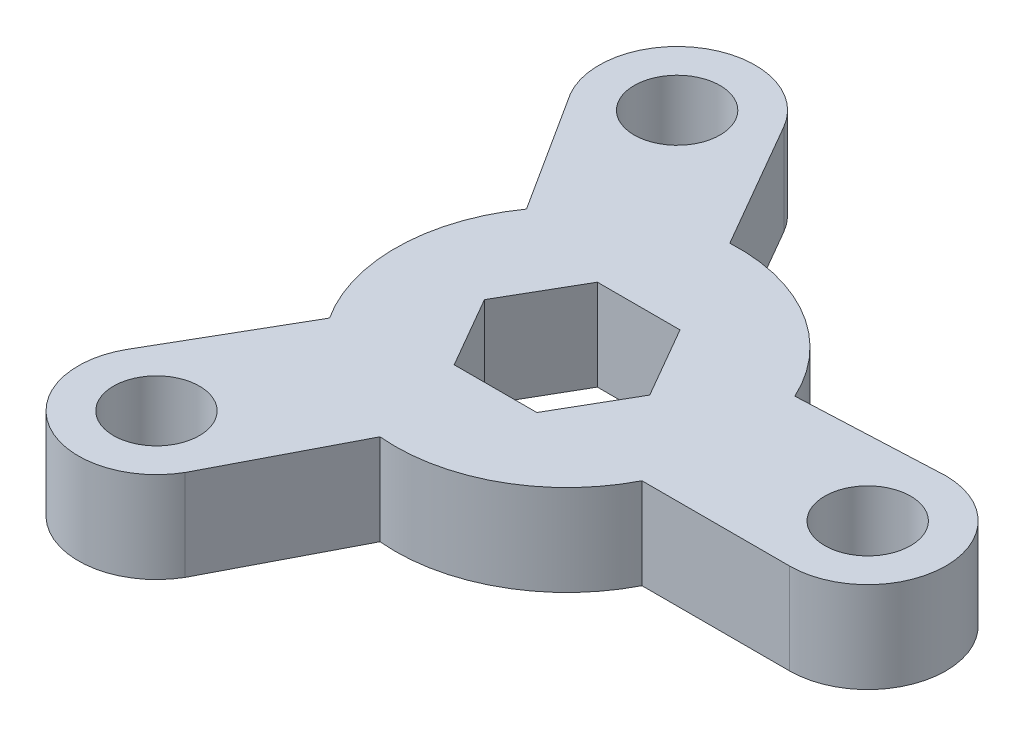
ISO-10303-21;
HEADER;
FILE_DESCRIPTION(('STEP AP214'),'2;1');
FILE_NAME('part.step','',(''),(''),'','','');
FILE_SCHEMA(('AUTOMOTIVE_DESIGN { 1 0 10303 214 1 1 1 1 }'));
ENDSEC;
DATA;
#1=APPLICATION_CONTEXT('core data for automotive mechanical design processes');
#2=APPLICATION_PROTOCOL_DEFINITION('international standard','automotive_design',2000,#1);
#3=PRODUCT_CONTEXT('',#1,'mechanical');
#4=PRODUCT('Part','Part','',(#3));
#5=PRODUCT_RELATED_PRODUCT_CATEGORY('part','',(#4));
#6=PRODUCT_DEFINITION_FORMATION('','',#4);
#7=PRODUCT_DEFINITION_CONTEXT('part definition',#1,'design');
#8=PRODUCT_DEFINITION('design','',#6,#7);
#9=PRODUCT_DEFINITION_SHAPE('','',#8);
#10=(LENGTH_UNIT() NAMED_UNIT(*) SI_UNIT(.MILLI.,.METRE.));
#11=(NAMED_UNIT(*) PLANE_ANGLE_UNIT() SI_UNIT($,.RADIAN.));
#12=(NAMED_UNIT(*) SI_UNIT($,.STERADIAN.) SOLID_ANGLE_UNIT());
#13=UNCERTAINTY_MEASURE_WITH_UNIT(LENGTH_MEASURE(1.E-05),#10,'distance_accuracy_value','');
#14=(GEOMETRIC_REPRESENTATION_CONTEXT(3) GLOBAL_UNCERTAINTY_ASSIGNED_CONTEXT((#13)) GLOBAL_UNIT_ASSIGNED_CONTEXT((#10,
#11,#12)) REPRESENTATION_CONTEXT('',''));
#15=CARTESIAN_POINT('',(0.,0.,0.));
#16=DIRECTION('',(0.,0.,1.));
#17=DIRECTION('',(1.,0.,0.));
#18=AXIS2_PLACEMENT_3D('',#15,#16,#17);
#19=CARTESIAN_POINT('',(-0.384954435025658,3.175,-0.222253546687804));
#20=DIRECTION('',(0.866025403784439,0.,0.5));
#21=DIRECTION('',(0.5,0.,-0.866025403784439));
#22=AXIS2_PLACEMENT_3D('',#19,#20,#21);
#23=PLANE('',#22);
#24=DIRECTION('',(-0.5,0.,0.866025403784439));
#25=VECTOR('',#24,1.);
#26=CARTESIAN_POINT('',(-0.384954435025658,0.,-0.222253546687804));
#27=LINE('',#26,#25);
#28=CARTESIAN_POINT('',(1.07138636872146,0.,-2.74470981191349));
#29=VERTEX_POINT('',#28);
#30=CARTESIAN_POINT('',(-0.371989304252619,0.,-0.244709811913483));
#31=VERTEX_POINT('',#30);
#32=EDGE_CURVE('E236',#29,#31,#27,.T.);
#33=ORIENTED_EDGE('',*,*,#32,.F.);
#34=DIRECTION('',(0.,-1.,0.));
#35=VECTOR('',#34,1.);
#36=CARTESIAN_POINT('',(1.07138636872146,3.175,-2.74470981191349));
#37=LINE('',#36,#35);
#38=CARTESIAN_POINT('',(1.07138636872146,3.175,-2.74470981191349));
#39=VERTEX_POINT('',#38);
#40=EDGE_CURVE('E11',#39,#29,#37,.T.);
#41=ORIENTED_EDGE('',*,*,#40,.F.);
#42=DIRECTION('',(-0.5,0.,0.866025403784439));
#43=VECTOR('',#42,1.);
#44=CARTESIAN_POINT('',(-0.384954435025658,3.175,-0.222253546687804));
#45=LINE('',#44,#43);
#46=CARTESIAN_POINT('',(-0.371989304252619,3.175,-0.244709811913483));
#47=VERTEX_POINT('',#46);
#48=EDGE_CURVE('E338',#39,#47,#45,.T.);
#49=ORIENTED_EDGE('',*,*,#48,.T.);
#50=DIRECTION('',(0.,-1.,0.));
#51=VECTOR('',#50,1.);
#52=CARTESIAN_POINT('',(-0.371989304252619,3.175,-0.244709811913483));
#53=LINE('',#52,#51);
#54=EDGE_CURVE('E52',#47,#31,#53,.T.);
#55=ORIENTED_EDGE('',*,*,#54,.T.);
#56=EDGE_LOOP('',(#33,#41,#49,#55));
#57=FACE_BOUND('',#56,.T.);
#58=ADVANCED_FACE('F33',(#57),#23,.T.);
#59=CARTESIAN_POINT('',(0.,3.175,-2.74470981191349));
#60=DIRECTION('',(0.,0.,1.));
#61=DIRECTION('',(1.,0.,0.));
#62=AXIS2_PLACEMENT_3D('',#59,#60,#61);
#63=PLANE('',#62);
#64=DIRECTION('',(-1.,0.,0.));
#65=VECTOR('',#64,1.);
#66=CARTESIAN_POINT('',(0.,0.,-2.74470981191349));
#67=LINE('',#66,#65);
#68=CARTESIAN_POINT('',(3.95813771466957,0.,-2.74470981191349));
#69=VERTEX_POINT('',#68);
#70=EDGE_CURVE('E238',#69,#29,#67,.T.);
#71=ORIENTED_EDGE('',*,*,#70,.F.);
#72=DIRECTION('',(0.,-1.,0.));
#73=VECTOR('',#72,1.);
#74=CARTESIAN_POINT('',(3.95813771466957,3.175,-2.74470981191349));
#75=LINE('',#74,#73);
#76=CARTESIAN_POINT('',(3.95813771466957,3.175,-2.74470981191349));
#77=VERTEX_POINT('',#76);
#78=EDGE_CURVE('E43',#77,#69,#75,.T.);
#79=ORIENTED_EDGE('',*,*,#78,.F.);
#80=DIRECTION('',(-1.,0.,0.));
#81=VECTOR('',#80,1.);
#82=CARTESIAN_POINT('',(0.,3.175,-2.74470981191349));
#83=LINE('',#82,#81);
#84=EDGE_CURVE('E340',#77,#39,#83,.T.);
#85=ORIENTED_EDGE('',*,*,#84,.T.);
#86=ORIENTED_EDGE('',*,*,#40,.T.);
#87=EDGE_LOOP('',(#71,#79,#85,#86));
#88=FACE_BOUND('',#87,.T.);
#89=ADVANCED_FACE('F365',(#88),#63,.T.);
#90=CARTESIAN_POINT('',(4.15709749756893,3.175,-2.40010135926894));
#91=DIRECTION('',(-0.866025403784439,0.,0.5));
#92=DIRECTION('',(0.5,0.,0.866025403784439));
#93=AXIS2_PLACEMENT_3D('',#90,#91,#92);
#94=PLANE('',#93);
#95=DIRECTION('',(-0.5,0.,-0.866025403784439));
#96=VECTOR('',#95,1.);
#97=CARTESIAN_POINT('',(4.15709749756893,0.,-2.40010135926894));
#98=LINE('',#97,#96);
#99=CARTESIAN_POINT('',(5.40151338764364,0.,-0.244709811913484));
#100=VERTEX_POINT('',#99);
#101=EDGE_CURVE('E241',#100,#69,#98,.T.);
#102=ORIENTED_EDGE('',*,*,#101,.F.);
#103=DIRECTION('',(0.,-1.,0.));
#104=VECTOR('',#103,1.);
#105=CARTESIAN_POINT('',(5.40151338764364,3.175,-0.244709811913484));
#106=LINE('',#105,#104);
#107=CARTESIAN_POINT('',(5.40151338764364,3.175,-0.244709811913484));
#108=VERTEX_POINT('',#107);
#109=EDGE_CURVE('E175',#108,#100,#106,.T.);
#110=ORIENTED_EDGE('',*,*,#109,.F.);
#111=DIRECTION('',(-0.5,0.,-0.866025403784439));
#112=VECTOR('',#111,1.);
#113=CARTESIAN_POINT('',(4.15709749756893,3.175,-2.40010135926894));
#114=LINE('',#113,#112);
#115=EDGE_CURVE('E187',#108,#77,#114,.T.);
#116=ORIENTED_EDGE('',*,*,#115,.T.);
#117=ORIENTED_EDGE('',*,*,#78,.T.);
#118=EDGE_LOOP('',(#102,#110,#116,#117));
#119=FACE_BOUND('',#118,.T.);
#120=ADVANCED_FACE('F344',(#119),#94,.T.);
#121=CARTESIAN_POINT('',(3.94517258389654,3.175,2.2777464533122));
#122=DIRECTION('',(-0.866025403784439,0.,-0.5));
#123=DIRECTION('',(-0.5,0.,0.866025403784439));
#124=AXIS2_PLACEMENT_3D('',#121,#122,#123);
#125=PLANE('',#124);
#126=DIRECTION('',(0.5,0.,-0.866025403784439));
#127=VECTOR('',#126,1.);
#128=CARTESIAN_POINT('',(3.94517258389654,0.,2.2777464533122));
#129=LINE('',#128,#127);
#130=CARTESIAN_POINT('',(3.95813771466958,0.,2.25529018808652));
#131=VERTEX_POINT('',#130);
#132=EDGE_CURVE('E171',#131,#100,#129,.T.);
#133=ORIENTED_EDGE('',*,*,#132,.F.);
#134=DIRECTION('',(0.,-1.,0.));
#135=VECTOR('',#134,1.);
#136=CARTESIAN_POINT('',(3.95813771466958,3.175,2.25529018808652));
#137=LINE('',#136,#135);
#138=CARTESIAN_POINT('',(3.95813771466958,3.175,2.25529018808652));
#139=VERTEX_POINT('',#138);
#140=EDGE_CURVE('E166',#139,#131,#137,.T.);
#141=ORIENTED_EDGE('',*,*,#140,.F.);
#142=DIRECTION('',(0.5,0.,-0.866025403784439));
#143=VECTOR('',#142,1.);
#144=CARTESIAN_POINT('',(3.94517258389654,3.175,2.2777464533122));
#145=LINE('',#144,#143);
#146=EDGE_CURVE('E169',#139,#108,#145,.T.);
#147=ORIENTED_EDGE('',*,*,#146,.T.);
#148=ORIENTED_EDGE('',*,*,#109,.T.);
#149=EDGE_LOOP('',(#133,#141,#147,#148));
#150=FACE_BOUND('',#149,.T.);
#151=ADVANCED_FACE('F168',(#150),#125,.T.);
#152=CARTESIAN_POINT('',(0.,3.175,2.25529018808652));
#153=DIRECTION('',(0.,0.,-1.));
#154=DIRECTION('',(-1.,0.,0.));
#155=AXIS2_PLACEMENT_3D('',#152,#153,#154);
#156=PLANE('',#155);
#157=DIRECTION('',(1.,0.,0.));
#158=VECTOR('',#157,1.);
#159=CARTESIAN_POINT('',(0.,0.,2.25529018808652));
#160=LINE('',#159,#158);
#161=CARTESIAN_POINT('',(1.07138636872144,0.,2.25529018808651));
#162=VERTEX_POINT('',#161);
#163=EDGE_CURVE('E245',#162,#131,#160,.T.);
#164=ORIENTED_EDGE('',*,*,#163,.F.);
#165=DIRECTION('',(0.,-1.,0.));
#166=VECTOR('',#165,1.);
#167=CARTESIAN_POINT('',(1.07138636872144,3.175,2.25529018808651));
#168=LINE('',#167,#166);
#169=CARTESIAN_POINT('',(1.07138636872144,3.175,2.25529018808651));
#170=VERTEX_POINT('',#169);
#171=EDGE_CURVE('E107',#170,#162,#168,.T.);
#172=ORIENTED_EDGE('',*,*,#171,.F.);
#173=DIRECTION('',(1.,0.,0.));
#174=VECTOR('',#173,1.);
#175=CARTESIAN_POINT('',(0.,3.175,2.25529018808652));
#176=LINE('',#175,#174);
#177=EDGE_CURVE('E184',#170,#139,#176,.T.);
#178=ORIENTED_EDGE('',*,*,#177,.T.);
#179=ORIENTED_EDGE('',*,*,#140,.T.);
#180=EDGE_LOOP('',(#164,#172,#178,#179));
#181=FACE_BOUND('',#180,.T.);
#182=ADVANCED_FACE('F189',(#181),#156,.T.);
#183=CARTESIAN_POINT('',(0.000141202008316191,3.175,-9.02915578254206E-05));
#184=DIRECTION('',(0.842481897664724,0.,-0.538724653331593));
#185=DIRECTION('',(-0.538724653331593,0.,-0.842481897664724));
#186=AXIS2_PLACEMENT_3D('',#183,#184,#185);
#187=PLANE('',#186);
#188=DIRECTION('',(0.538724653331593,0.,0.842481897664724));
#189=VECTOR('',#188,1.);
#190=CARTESIAN_POINT('',(0.000141202008316191,0.,-9.02915578254206E-05));
#191=LINE('',#190,#189);
#192=CARTESIAN_POINT('',(-5.09848661235624,0.,-7.97355430507133));
#193=VERTEX_POINT('',#192);
#194=CARTESIAN_POINT('',(-2.37747949642448,0.,-3.71832071883632));
#195=VERTEX_POINT('',#194);
#196=EDGE_CURVE('E202',#193,#195,#191,.T.);
#197=ORIENTED_EDGE('',*,*,#196,.T.);
#198=DIRECTION('',(0.,-1.,0.));
#199=VECTOR('',#198,1.);
#200=CARTESIAN_POINT('',(-2.37747949642448,3.175,-3.71832071883632));
#201=LINE('',#200,#199);
#202=CARTESIAN_POINT('',(-2.37747949642448,3.175,-3.71832071883632));
#203=VERTEX_POINT('',#202);
#204=EDGE_CURVE('E37',#203,#195,#201,.T.);
#205=ORIENTED_EDGE('',*,*,#204,.F.);
#206=DIRECTION('',(0.538724653331593,0.,0.842481897664724));
#207=VECTOR('',#206,1.);
#208=CARTESIAN_POINT('',(0.000141202008316191,3.175,-9.02915578254206E-05));
#209=LINE('',#208,#207);
#210=CARTESIAN_POINT('',(-5.09848661235624,3.175,-7.97355430507133));
#211=VERTEX_POINT('',#210);
#212=EDGE_CURVE('E256',#211,#203,#209,.T.);
#213=ORIENTED_EDGE('',*,*,#212,.F.);
#214=DIRECTION('',(0.,-1.,0.));
#215=VECTOR('',#214,1.);
#216=CARTESIAN_POINT('',(-5.09848661235624,3.175,-7.97355430507133));
#217=LINE('',#216,#215);
#218=EDGE_CURVE('E201',#211,#193,#217,.T.);
#219=ORIENTED_EDGE('',*,*,#218,.T.);
#220=EDGE_LOOP('',(#197,#205,#213,#219));
#221=FACE_BOUND('',#220,.T.);
#222=ADVANCED_FACE('F35',(#221),#187,.F.);
#223=CARTESIAN_POINT('',(2.51476204169551,3.175,-0.244709811913484));
#224=DIRECTION('',(0.,-1.,0.));
#225=DIRECTION('',(0.,0.,-1.));
#226=AXIS2_PLACEMENT_3D('',#223,#224,#225);
#227=CYLINDRICAL_SURFACE('',#226,6.);
#228=CARTESIAN_POINT('',(2.51476204169551,0.,-0.244709811913484));
#229=DIRECTION('',(0.,1.,0.));
#230=DIRECTION('',(0.,0.,1.));
#231=AXIS2_PLACEMENT_3D('',#228,#229,#230);
#232=CIRCLE('',#231,6.);
#233=CARTESIAN_POINT('',(-2.5202560509571,0.,3.01850835527376));
#234=VERTEX_POINT('',#233);
#235=EDGE_CURVE('E205',#195,#234,#232,.T.);
#236=ORIENTED_EDGE('',*,*,#235,.T.);
#237=DIRECTION('',(0.,-1.,0.));
#238=VECTOR('',#237,1.);
#239=CARTESIAN_POINT('',(-2.5202560509571,3.175,3.01850835527376));
#240=LINE('',#239,#238);
#241=CARTESIAN_POINT('',(-2.5202560509571,3.175,3.01850835527376));
#242=VERTEX_POINT('',#241);
#243=EDGE_CURVE('E284',#242,#234,#240,.T.);
#244=ORIENTED_EDGE('',*,*,#243,.F.);
#245=CARTESIAN_POINT('',(2.51476204169551,3.175,-0.244709811913484));
#246=DIRECTION('',(0.,1.,0.));
#247=DIRECTION('',(0.,0.,1.));
#248=AXIS2_PLACEMENT_3D('',#245,#246,#247);
#249=CIRCLE('',#248,6.);
#250=EDGE_CURVE('E120',#203,#242,#249,.T.);
#251=ORIENTED_EDGE('',*,*,#250,.F.);
#252=ORIENTED_EDGE('',*,*,#204,.T.);
#253=EDGE_LOOP('',(#236,#244,#251,#252));
#254=FACE_BOUND('',#253,.T.);
#255=ADVANCED_FACE('F289',(#254),#227,.T.);
#256=CARTESIAN_POINT('',(-0.583139579616475,3.175,-0.336675793266701));
#257=DIRECTION('',(-0.866025403784436,0.,-0.500000000000004));
#258=DIRECTION('',(-0.500000000000004,0.,0.866025403784436));
#259=AXIS2_PLACEMENT_3D('',#256,#257,#258);
#260=PLANE('',#259);
#261=DIRECTION('',(0.500000000000004,0.,-0.866025403784436));
#262=VECTOR('',#261,1.);
#263=CARTESIAN_POINT('',(-0.583139579616475,0.,-0.336675793266701));
#264=LINE('',#263,#262);
#265=CARTESIAN_POINT('',(-5.09848661235643,0.,7.48413468124418));
#266=VERTEX_POINT('',#265);
#267=EDGE_CURVE('E208',#266,#234,#264,.T.);
#268=ORIENTED_EDGE('',*,*,#267,.F.);
#269=DIRECTION('',(0.,-1.,0.));
#270=VECTOR('',#269,1.);
#271=CARTESIAN_POINT('',(-5.09848661235643,3.175,7.48413468124418));
#272=LINE('',#271,#270);
#273=CARTESIAN_POINT('',(-5.09848661235643,3.175,7.48413468124418));
#274=VERTEX_POINT('',#273);
#275=EDGE_CURVE('E283',#274,#266,#272,.T.);
#276=ORIENTED_EDGE('',*,*,#275,.F.);
#277=DIRECTION('',(0.500000000000004,0.,-0.866025403784436));
#278=VECTOR('',#277,1.);
#279=CARTESIAN_POINT('',(-0.583139579616475,3.175,-0.336675793266701));
#280=LINE('',#279,#278);
#281=EDGE_CURVE('E304',#274,#242,#280,.T.);
#282=ORIENTED_EDGE('',*,*,#281,.T.);
#283=ORIENTED_EDGE('',*,*,#243,.T.);
#284=EDGE_LOOP('',(#268,#276,#282,#283));
#285=FACE_BOUND('',#284,.T.);
#286=ADVANCED_FACE('F301',(#285),#260,.T.);
#287=CARTESIAN_POINT('',(-2.73523795830457,3.175,8.84855692782308));
#288=DIRECTION('',(0.,-1.,0.));
#289=DIRECTION('',(0.,0.,-1.));
#290=AXIS2_PLACEMENT_3D('',#287,#288,#289);
#291=CYLINDRICAL_SURFACE('',#290,2.72884449315773);
#292=CARTESIAN_POINT('',(-2.73523795830457,0.,8.84855692782308));
#293=DIRECTION('',(0.,1.,0.));
#294=DIRECTION('',(0.,0.,1.));
#295=AXIS2_PLACEMENT_3D('',#292,#293,#294);
#296=CIRCLE('',#295,2.72884449315773);
#297=CARTESIAN_POINT('',(-0.371989304252718,0.,10.212979174402));
#298=VERTEX_POINT('',#297);
#299=EDGE_CURVE('E211',#266,#298,#296,.T.);
#300=ORIENTED_EDGE('',*,*,#299,.T.);
#301=DIRECTION('',(0.,-1.,0.));
#302=VECTOR('',#301,1.);
#303=CARTESIAN_POINT('',(-0.371989304252718,3.175,10.212979174402));
#304=LINE('',#303,#302);
#305=CARTESIAN_POINT('',(-0.371989304252718,3.175,10.212979174402));
#306=VERTEX_POINT('',#305);
#307=EDGE_CURVE('E280',#306,#298,#304,.T.);
#308=ORIENTED_EDGE('',*,*,#307,.F.);
#309=CARTESIAN_POINT('',(-2.73523795830457,3.175,8.84855692782308));
#310=DIRECTION('',(0.,1.,0.));
#311=DIRECTION('',(0.,0.,1.));
#312=AXIS2_PLACEMENT_3D('',#309,#310,#311);
#313=CIRCLE('',#312,2.72884449315773);
#314=EDGE_CURVE('E307',#274,#306,#313,.T.);
#315=ORIENTED_EDGE('',*,*,#314,.F.);
#316=ORIENTED_EDGE('',*,*,#275,.T.);
#317=EDGE_LOOP('',(#300,#308,#315,#316));
#318=FACE_BOUND('',#317,.T.);
#319=ADVANCED_FACE('F308',(#318),#291,.T.);
#320=CARTESIAN_POINT('',(3.87987291900581,3.175,2.01140464348338));
#321=DIRECTION('',(-0.887790184262489,0.,-0.460248398940372));
#322=DIRECTION('',(-0.460248398940372,0.,0.887790184262489));
#323=AXIS2_PLACEMENT_3D('',#320,#321,#322);
#324=PLANE('',#323);
#325=DIRECTION('',(0.460248398940372,0.,-0.887790184262489));
#326=VECTOR('',#325,1.);
#327=CARTESIAN_POINT('',(3.87987291900581,0.,2.01140464348338));
#328=LINE('',#327,#326);
#329=CARTESIAN_POINT('',(1.95264752249766,0.,5.72890109500931));
#330=VERTEX_POINT('',#329);
#331=EDGE_CURVE('E213',#298,#330,#328,.T.);
#332=ORIENTED_EDGE('',*,*,#331,.T.);
#333=DIRECTION('',(0.,-1.,0.));
#334=VECTOR('',#333,1.);
#335=CARTESIAN_POINT('',(1.95264752249766,3.175,5.72890109500931));
#336=LINE('',#335,#334);
#337=CARTESIAN_POINT('',(1.95264752249766,3.175,5.72890109500931));
#338=VERTEX_POINT('',#337);
#339=EDGE_CURVE('E277',#338,#330,#336,.T.);
#340=ORIENTED_EDGE('',*,*,#339,.F.);
#341=DIRECTION('',(0.460248398940372,0.,-0.887790184262489));
#342=VECTOR('',#341,1.);
#343=CARTESIAN_POINT('',(3.87987291900581,3.175,2.01140464348338));
#344=LINE('',#343,#342);
#345=EDGE_CURVE('E311',#306,#338,#344,.T.);
#346=ORIENTED_EDGE('',*,*,#345,.F.);
#347=ORIENTED_EDGE('',*,*,#307,.T.);
#348=EDGE_LOOP('',(#332,#340,#346,#347));
#349=FACE_BOUND('',#348,.T.);
#350=ADVANCED_FACE('F400',(#349),#324,.F.);
#351=CARTESIAN_POINT('',(2.51476204169551,3.175,-0.244709811913484));
#352=DIRECTION('',(0.,-1.,0.));
#353=DIRECTION('',(0.,0.,-1.));
#354=AXIS2_PLACEMENT_3D('',#351,#352,#353);
#355=CYLINDRICAL_SURFACE('',#354,6.);
#356=CARTESIAN_POINT('',(2.51476204169551,0.,-0.244709811913484));
#357=DIRECTION('',(0.,1.,0.));
#358=DIRECTION('',(0.,0.,1.));
#359=AXIS2_PLACEMENT_3D('',#356,#357,#358);
#360=CIRCLE('',#359,6.);
#361=CARTESIAN_POINT('',(7.85830091889688,0.,2.4841346812443));
#362=VERTEX_POINT('',#361);
#363=EDGE_CURVE('E215',#330,#362,#360,.T.);
#364=ORIENTED_EDGE('',*,*,#363,.T.);
#365=DIRECTION('',(0.,-1.,0.));
#366=VECTOR('',#365,1.);
#367=CARTESIAN_POINT('',(7.85830091889688,3.175,2.4841346812443));
#368=LINE('',#367,#366);
#369=CARTESIAN_POINT('',(7.85830091889688,3.175,2.4841346812443));
#370=VERTEX_POINT('',#369);
#371=EDGE_CURVE('E275',#370,#362,#368,.T.);
#372=ORIENTED_EDGE('',*,*,#371,.F.);
#373=CARTESIAN_POINT('',(2.51476204169551,3.175,-0.244709811913484));
#374=DIRECTION('',(0.,1.,0.));
#375=DIRECTION('',(0.,0.,1.));
#376=AXIS2_PLACEMENT_3D('',#373,#374,#375);
#377=CIRCLE('',#376,6.);
#378=EDGE_CURVE('E319',#338,#370,#377,.T.);
#379=ORIENTED_EDGE('',*,*,#378,.F.);
#380=ORIENTED_EDGE('',*,*,#339,.T.);
#381=EDGE_LOOP('',(#364,#372,#379,#380));
#382=FACE_BOUND('',#381,.T.);
#383=ADVANCED_FACE('F396',(#382),#355,.T.);
#384=CARTESIAN_POINT('',(0.,3.175,2.4841346812442));
#385=DIRECTION('',(0.,0.,1.));
#386=DIRECTION('',(1.,0.,0.));
#387=AXIS2_PLACEMENT_3D('',#384,#385,#386);
#388=PLANE('',#387);
#389=DIRECTION('',(-1.,0.,0.));
#390=VECTOR('',#389,1.);
#391=CARTESIAN_POINT('',(0.,0.,2.4841346812442));
#392=LINE('',#391,#390);
#393=CARTESIAN_POINT('',(13.0147620416955,0.,2.48413468124436));
#394=VERTEX_POINT('',#393);
#395=EDGE_CURVE('E218',#394,#362,#392,.T.);
#396=ORIENTED_EDGE('',*,*,#395,.F.);
#397=DIRECTION('',(0.,-1.,0.));
#398=VECTOR('',#397,1.);
#399=CARTESIAN_POINT('',(13.0147620416955,3.175,2.48413468124436));
#400=LINE('',#399,#398);
#401=CARTESIAN_POINT('',(13.0147620416955,3.175,2.48413468124436));
#402=VERTEX_POINT('',#401);
#403=EDGE_CURVE('E273',#402,#394,#400,.T.);
#404=ORIENTED_EDGE('',*,*,#403,.F.);
#405=DIRECTION('',(-1.,0.,0.));
#406=VECTOR('',#405,1.);
#407=CARTESIAN_POINT('',(0.,3.175,2.4841346812442));
#408=LINE('',#407,#406);
#409=EDGE_CURVE('E321',#402,#370,#408,.T.);
#410=ORIENTED_EDGE('',*,*,#409,.T.);
#411=ORIENTED_EDGE('',*,*,#371,.T.);
#412=EDGE_LOOP('',(#396,#404,#410,#411));
#413=FACE_BOUND('',#412,.T.);
#414=ADVANCED_FACE('F392',(#413),#388,.T.);
#415=CARTESIAN_POINT('',(13.0147620416955,3.175,-0.244709811913377));
#416=DIRECTION('',(0.,-1.,0.));
#417=DIRECTION('',(0.,0.,-1.));
#418=AXIS2_PLACEMENT_3D('',#415,#416,#417);
#419=CYLINDRICAL_SURFACE('',#418,2.72884449315774);
#420=CARTESIAN_POINT('',(13.0147620416955,0.,-0.244709811913377));
#421=DIRECTION('',(0.,1.,0.));
#422=DIRECTION('',(0.,0.,1.));
#423=AXIS2_PLACEMENT_3D('',#420,#421,#422);
#424=CIRCLE('',#423,2.72884449315774);
#425=CARTESIAN_POINT('',(13.0147620416956,0.,-2.97355430507112));
#426=VERTEX_POINT('',#425);
#427=EDGE_CURVE('E221',#394,#426,#424,.T.);
#428=ORIENTED_EDGE('',*,*,#427,.T.);
#429=DIRECTION('',(0.,-1.,0.));
#430=VECTOR('',#429,1.);
#431=CARTESIAN_POINT('',(13.0147620416956,3.175,-2.97355430507112));
#432=LINE('',#431,#430);
#433=CARTESIAN_POINT('',(13.0147620416956,3.175,-2.97355430507112));
#434=VERTEX_POINT('',#433);
#435=EDGE_CURVE('E270',#434,#426,#432,.T.);
#436=ORIENTED_EDGE('',*,*,#435,.F.);
#437=CARTESIAN_POINT('',(13.0147620416955,3.175,-0.244709811913377));
#438=DIRECTION('',(0.,1.,0.));
#439=DIRECTION('',(0.,0.,1.));
#440=AXIS2_PLACEMENT_3D('',#437,#438,#439);
#441=CIRCLE('',#440,2.72884449315774);
#442=EDGE_CURVE('E324',#402,#434,#441,.T.);
#443=ORIENTED_EDGE('',*,*,#442,.F.);
#444=ORIENTED_EDGE('',*,*,#403,.T.);
#445=EDGE_LOOP('',(#428,#436,#443,#444));
#446=FACE_BOUND('',#445,.T.);
#447=ADVANCED_FACE('F388',(#446),#419,.T.);
#448=CARTESIAN_POINT('',(-0.107871058470845,3.175,-2.37837906979585));
#449=DIRECTION('',(0.0453082865977618,0.,0.998973052271969));
#450=DIRECTION('',(0.99897305227197,0.,-0.0453082865977618));
#451=AXIS2_PLACEMENT_3D('',#448,#449,#450);
#452=PLANE('',#451);
#453=DIRECTION('',(-0.998973052271969,0.,0.0453082865977618));
#454=VECTOR('',#453,1.);
#455=CARTESIAN_POINT('',(-0.107871058470845,0.,-2.37837906979585));
#456=LINE('',#455,#454);
#457=CARTESIAN_POINT('',(7.96911809901337,0.,-2.74470981191349));
#458=VERTEX_POINT('',#457);
#459=EDGE_CURVE('E223',#426,#458,#456,.T.);
#460=ORIENTED_EDGE('',*,*,#459,.T.);
#461=DIRECTION('',(0.,-1.,0.));
#462=VECTOR('',#461,1.);
#463=CARTESIAN_POINT('',(7.96911809901337,3.175,-2.74470981191349));
#464=LINE('',#463,#462);
#465=CARTESIAN_POINT('',(7.96911809901337,3.175,-2.74470981191349));
#466=VERTEX_POINT('',#465);
#467=EDGE_CURVE('E267',#466,#458,#464,.T.);
#468=ORIENTED_EDGE('',*,*,#467,.F.);
#469=DIRECTION('',(-0.998973052271969,0.,0.0453082865977618));
#470=VECTOR('',#469,1.);
#471=CARTESIAN_POINT('',(-0.107871058470845,3.175,-2.37837906979585));
#472=LINE('',#471,#470);
#473=EDGE_CURVE('E326',#434,#466,#472,.T.);
#474=ORIENTED_EDGE('',*,*,#473,.F.);
#475=ORIENTED_EDGE('',*,*,#435,.T.);
#476=EDGE_LOOP('',(#460,#468,#474,#475));
#477=FACE_BOUND('',#476,.T.);
#478=ADVANCED_FACE('F384',(#477),#452,.F.);
#479=CARTESIAN_POINT('',(2.51476204169551,3.175,-0.244709811913484));
#480=DIRECTION('',(0.,-1.,0.));
#481=DIRECTION('',(0.,0.,-1.));
#482=AXIS2_PLACEMENT_3D('',#479,#480,#481);
#483=CYLINDRICAL_SURFACE('',#482,6.);
#484=CARTESIAN_POINT('',(2.51476204169551,0.,-0.244709811913484));
#485=DIRECTION('',(0.,1.,0.));
#486=DIRECTION('',(0.,0.,1.));
#487=AXIS2_PLACEMENT_3D('',#484,#485,#486);
#488=CIRCLE('',#487,6.);
#489=CARTESIAN_POINT('',(2.2062412571468,0.,-6.23677247225854));
#490=VERTEX_POINT('',#489);
#491=EDGE_CURVE('E225',#458,#490,#488,.T.);
#492=ORIENTED_EDGE('',*,*,#491,.T.);
#493=DIRECTION('',(0.,-1.,0.));
#494=VECTOR('',#493,1.);
#495=CARTESIAN_POINT('',(2.2062412571468,3.175,-6.23677247225854));
#496=LINE('',#495,#494);
#497=CARTESIAN_POINT('',(2.2062412571468,3.175,-6.23677247225854));
#498=VERTEX_POINT('',#497);
#499=EDGE_CURVE('E265',#498,#490,#496,.T.);
#500=ORIENTED_EDGE('',*,*,#499,.F.);
#501=CARTESIAN_POINT('',(2.51476204169551,3.175,-0.244709811913484));
#502=DIRECTION('',(0.,1.,0.));
#503=DIRECTION('',(0.,0.,1.));
#504=AXIS2_PLACEMENT_3D('',#501,#502,#503);
#505=CIRCLE('',#504,6.);
#506=EDGE_CURVE('E328',#466,#498,#505,.T.);
#507=ORIENTED_EDGE('',*,*,#506,.F.);
#508=ORIENTED_EDGE('',*,*,#467,.T.);
#509=EDGE_LOOP('',(#492,#500,#507,#508));
#510=FACE_BOUND('',#509,.T.);
#511=ADVANCED_FACE('F380',(#510),#483,.T.);
#512=CARTESIAN_POINT('',(4.3552826421598,3.175,-2.51452360584792));
#513=DIRECTION('',(0.866025403784434,0.,-0.500000000000008));
#514=DIRECTION('',(-0.500000000000008,0.,-0.866025403784434));
#515=AXIS2_PLACEMENT_3D('',#512,#513,#514);
#516=PLANE('',#515);
#517=DIRECTION('',(0.500000000000009,0.,0.866025403784434));
#518=VECTOR('',#517,1.);
#519=CARTESIAN_POINT('',(4.3552826421598,0.,-2.51452360584792));
#520=LINE('',#519,#518);
#521=CARTESIAN_POINT('',(-0.371989304252549,0.,-10.7023987982289));
#522=VERTEX_POINT('',#521);
#523=EDGE_CURVE('E228',#522,#490,#520,.T.);
#524=ORIENTED_EDGE('',*,*,#523,.F.);
#525=DIRECTION('',(0.,-1.,0.));
#526=VECTOR('',#525,1.);
#527=CARTESIAN_POINT('',(-0.371989304252549,3.175,-10.7023987982289));
#528=LINE('',#527,#526);
#529=CARTESIAN_POINT('',(-0.371989304252549,3.175,-10.7023987982289));
#530=VERTEX_POINT('',#529);
#531=EDGE_CURVE('E263',#530,#522,#528,.T.);
#532=ORIENTED_EDGE('',*,*,#531,.F.);
#533=DIRECTION('',(0.500000000000009,0.,0.866025403784434));
#534=VECTOR('',#533,1.);
#535=CARTESIAN_POINT('',(4.3552826421598,3.175,-2.51452360584792));
#536=LINE('',#535,#534);
#537=EDGE_CURVE('E330',#530,#498,#536,.T.);
#538=ORIENTED_EDGE('',*,*,#537,.T.);
#539=ORIENTED_EDGE('',*,*,#499,.T.);
#540=EDGE_LOOP('',(#524,#532,#538,#539));
#541=FACE_BOUND('',#540,.T.);
#542=ADVANCED_FACE('F360',(#541),#516,.T.);
#543=CARTESIAN_POINT('',(-2.73523795830453,3.175,8.8485569278231));
#544=DIRECTION('',(0.,-1.,0.));
#545=DIRECTION('',(0.,0.,-1.));
#546=AXIS2_PLACEMENT_3D('',#543,#544,#545);
#547=CYLINDRICAL_SURFACE('',#546,1.5);
#548=CARTESIAN_POINT('',(-2.73523795830453,3.175,8.8485569278231));
#549=DIRECTION('',(0.,1.,0.));
#550=DIRECTION('',(0.,0.,1.));
#551=AXIS2_PLACEMENT_3D('',#548,#549,#550);
#552=CIRCLE('',#551,1.5);
#553=CARTESIAN_POINT('',(-2.73523795830453,3.175,10.3485569278231));
#554=VERTEX_POINT('',#553);
#555=EDGE_CURVE('E192',#554,#554,#552,.T.);
#556=ORIENTED_EDGE('',*,*,#555,.T.);
#557=EDGE_LOOP('',(#556));
#558=FACE_BOUND('',#557,.T.);
#559=CARTESIAN_POINT('',(-2.73523795830453,0.,8.8485569278231));
#560=DIRECTION('',(0.,1.,0.));
#561=DIRECTION('',(0.,0.,1.));
#562=AXIS2_PLACEMENT_3D('',#559,#560,#561);
#563=CIRCLE('',#562,1.5);
#564=CARTESIAN_POINT('',(-2.73523795830453,0.,10.3485569278231));
#565=VERTEX_POINT('',#564);
#566=EDGE_CURVE('E250',#565,#565,#563,.T.);
#567=ORIENTED_EDGE('',*,*,#566,.F.);
#568=EDGE_LOOP('',(#567));
#569=FACE_BOUND('',#568,.T.);
#570=ADVANCED_FACE('F351',(#558,#569),#547,.F.);
#571=CARTESIAN_POINT('',(-0.173029521353271,3.175,0.0998986407310628));
#572=DIRECTION('',(0.866025403784439,0.,-0.5));
#573=DIRECTION('',(-0.5,0.,-0.866025403784439));
#574=AXIS2_PLACEMENT_3D('',#571,#572,#573);
#575=PLANE('',#574);
#576=DIRECTION('',(0.5,0.,0.866025403784439));
#577=VECTOR('',#576,1.);
#578=CARTESIAN_POINT('',(-0.173029521353271,0.,0.0998986407310628));
#579=LINE('',#578,#577);
#580=EDGE_CURVE('E247',#31,#162,#579,.T.);
#581=ORIENTED_EDGE('',*,*,#580,.F.);
#582=ORIENTED_EDGE('',*,*,#54,.F.);
#583=DIRECTION('',(0.5,0.,0.866025403784439));
#584=VECTOR('',#583,1.);
#585=CARTESIAN_POINT('',(-0.173029521353271,3.175,0.0998986407310628));
#586=LINE('',#585,#584);
#587=EDGE_CURVE('E190',#47,#170,#586,.T.);
#588=ORIENTED_EDGE('',*,*,#587,.T.);
#589=ORIENTED_EDGE('',*,*,#171,.T.);
#590=EDGE_LOOP('',(#581,#582,#588,#589));
#591=FACE_BOUND('',#590,.T.);
#592=ADVANCED_FACE('F348',(#591),#575,.T.);
#593=CARTESIAN_POINT('',(13.0147620416955,3.175,-0.244709811913484));
#594=DIRECTION('',(0.,-1.,0.));
#595=DIRECTION('',(0.,0.,-1.));
#596=AXIS2_PLACEMENT_3D('',#593,#594,#595);
#597=CYLINDRICAL_SURFACE('',#596,1.5);
#598=CARTESIAN_POINT('',(13.0147620416955,3.175,-0.244709811913484));
#599=DIRECTION('',(0.,1.,0.));
#600=DIRECTION('',(0.,0.,1.));
#601=AXIS2_PLACEMENT_3D('',#598,#599,#600);
#602=CIRCLE('',#601,1.5);
#603=CARTESIAN_POINT('',(13.0147620416955,3.175,1.25529018808651));
#604=VERTEX_POINT('',#603);
#605=EDGE_CURVE('E335',#604,#604,#602,.T.);
#606=ORIENTED_EDGE('',*,*,#605,.T.);
#607=EDGE_LOOP('',(#606));
#608=FACE_BOUND('',#607,.T.);
#609=CARTESIAN_POINT('',(13.0147620416955,0.,-0.244709811913484));
#610=DIRECTION('',(0.,1.,0.));
#611=DIRECTION('',(0.,0.,1.));
#612=AXIS2_PLACEMENT_3D('',#609,#610,#611);
#613=CIRCLE('',#612,1.5);
#614=CARTESIAN_POINT('',(13.0147620416955,0.,1.25529018808651));
#615=VERTEX_POINT('',#614);
#616=EDGE_CURVE('E233',#615,#615,#613,.T.);
#617=ORIENTED_EDGE('',*,*,#616,.F.);
#618=EDGE_LOOP('',(#617));
#619=FACE_BOUND('',#618,.T.);
#620=ADVANCED_FACE('F350',(#608,#619),#597,.F.);
#621=CARTESIAN_POINT('',(-2.73523795830442,3.175,-9.33797655165006));
#622=DIRECTION('',(0.,-1.,0.));
#623=DIRECTION('',(0.,0.,-1.));
#624=AXIS2_PLACEMENT_3D('',#621,#622,#623);
#625=CYLINDRICAL_SURFACE('',#624,2.72884449315776);
#626=CARTESIAN_POINT('',(-2.73523795830442,0.,-9.33797655165006));
#627=DIRECTION('',(0.,1.,0.));
#628=DIRECTION('',(0.,0.,1.));
#629=AXIS2_PLACEMENT_3D('',#626,#627,#628);
#630=CIRCLE('',#629,2.72884449315776);
#631=EDGE_CURVE('E231',#522,#193,#630,.T.);
#632=ORIENTED_EDGE('',*,*,#631,.T.);
#633=ORIENTED_EDGE('',*,*,#218,.F.);
#634=CARTESIAN_POINT('',(-2.73523795830442,3.175,-9.33797655165006));
#635=DIRECTION('',(0.,1.,0.));
#636=DIRECTION('',(0.,0.,1.));
#637=AXIS2_PLACEMENT_3D('',#634,#635,#636);
#638=CIRCLE('',#637,2.72884449315776);
#639=EDGE_CURVE('E333',#530,#211,#638,.T.);
#640=ORIENTED_EDGE('',*,*,#639,.F.);
#641=ORIENTED_EDGE('',*,*,#531,.T.);
#642=EDGE_LOOP('',(#632,#633,#640,#641));
#643=FACE_BOUND('',#642,.T.);
#644=ADVANCED_FACE('F357',(#643),#625,.T.);
#645=CARTESIAN_POINT('',(-2.73523795830442,3.175,-9.33797655165006));
#646=DIRECTION('',(0.,-1.,0.));
#647=DIRECTION('',(0.,0.,-1.));
#648=AXIS2_PLACEMENT_3D('',#645,#646,#647);
#649=CYLINDRICAL_SURFACE('',#648,1.49999999999994);
#650=CARTESIAN_POINT('',(-2.73523795830442,3.175,-9.33797655165006));
#651=DIRECTION('',(0.,1.,0.));
#652=DIRECTION('',(0.,0.,1.));
#653=AXIS2_PLACEMENT_3D('',#650,#651,#652);
#654=CIRCLE('',#653,1.49999999999994);
#655=CARTESIAN_POINT('',(-2.73523795830442,3.175,-7.83797655165011));
#656=VERTEX_POINT('',#655);
#657=EDGE_CURVE('E198',#656,#656,#654,.T.);
#658=ORIENTED_EDGE('',*,*,#657,.T.);
#659=EDGE_LOOP('',(#658));
#660=FACE_BOUND('',#659,.T.);
#661=CARTESIAN_POINT('',(-2.73523795830442,0.,-9.33797655165006));
#662=DIRECTION('',(0.,1.,0.));
#663=DIRECTION('',(0.,0.,1.));
#664=AXIS2_PLACEMENT_3D('',#661,#662,#663);
#665=CIRCLE('',#664,1.49999999999994);
#666=CARTESIAN_POINT('',(-2.73523795830442,0.,-7.83797655165011));
#667=VERTEX_POINT('',#666);
#668=EDGE_CURVE('E253',#667,#667,#665,.T.);
#669=ORIENTED_EDGE('',*,*,#668,.F.);
#670=EDGE_LOOP('',(#669));
#671=FACE_BOUND('',#670,.T.);
#672=ADVANCED_FACE('F376',(#660,#671),#649,.F.);
#673=CARTESIAN_POINT('',(0.,3.175,0.));
#674=DIRECTION('',(0.,1.,0.));
#675=DIRECTION('',(0.,0.,1.));
#676=AXIS2_PLACEMENT_3D('',#673,#674,#675);
#677=PLANE('',#676);
#678=ORIENTED_EDGE('',*,*,#212,.T.);
#679=ORIENTED_EDGE('',*,*,#250,.T.);
#680=ORIENTED_EDGE('',*,*,#281,.F.);
#681=ORIENTED_EDGE('',*,*,#314,.T.);
#682=ORIENTED_EDGE('',*,*,#345,.T.);
#683=ORIENTED_EDGE('',*,*,#378,.T.);
#684=ORIENTED_EDGE('',*,*,#409,.F.);
#685=ORIENTED_EDGE('',*,*,#442,.T.);
#686=ORIENTED_EDGE('',*,*,#473,.T.);
#687=ORIENTED_EDGE('',*,*,#506,.T.);
#688=ORIENTED_EDGE('',*,*,#537,.F.);
#689=ORIENTED_EDGE('',*,*,#639,.T.);
#690=EDGE_LOOP('',(#678,#679,#680,#681,#682,#683,#684,#685,#686,#687,#688,#689));
#691=FACE_BOUND('',#690,.T.);
#692=ORIENTED_EDGE('',*,*,#605,.F.);
#693=EDGE_LOOP('',(#692));
#694=FACE_BOUND('',#693,.T.);
#695=ORIENTED_EDGE('',*,*,#48,.F.);
#696=ORIENTED_EDGE('',*,*,#84,.F.);
#697=ORIENTED_EDGE('',*,*,#115,.F.);
#698=ORIENTED_EDGE('',*,*,#146,.F.);
#699=ORIENTED_EDGE('',*,*,#177,.F.);
#700=ORIENTED_EDGE('',*,*,#587,.F.);
#701=EDGE_LOOP('',(#695,#696,#697,#698,#699,#700));
#702=FACE_BOUND('',#701,.T.);
#703=ORIENTED_EDGE('',*,*,#555,.F.);
#704=EDGE_LOOP('',(#703));
#705=FACE_BOUND('',#704,.T.);
#706=ORIENTED_EDGE('',*,*,#657,.F.);
#707=EDGE_LOOP('',(#706));
#708=FACE_BOUND('',#707,.T.);
#709=ADVANCED_FACE('F181',(#691,#694,#702,#705,#708),#677,.T.);
#710=CARTESIAN_POINT('',(0.,0.,0.));
#711=DIRECTION('',(0.,1.,0.));
#712=DIRECTION('',(0.,0.,1.));
#713=AXIS2_PLACEMENT_3D('',#710,#711,#712);
#714=PLANE('',#713);
#715=ORIENTED_EDGE('',*,*,#196,.F.);
#716=ORIENTED_EDGE('',*,*,#631,.F.);
#717=ORIENTED_EDGE('',*,*,#523,.T.);
#718=ORIENTED_EDGE('',*,*,#491,.F.);
#719=ORIENTED_EDGE('',*,*,#459,.F.);
#720=ORIENTED_EDGE('',*,*,#427,.F.);
#721=ORIENTED_EDGE('',*,*,#395,.T.);
#722=ORIENTED_EDGE('',*,*,#363,.F.);
#723=ORIENTED_EDGE('',*,*,#331,.F.);
#724=ORIENTED_EDGE('',*,*,#299,.F.);
#725=ORIENTED_EDGE('',*,*,#267,.T.);
#726=ORIENTED_EDGE('',*,*,#235,.F.);
#727=EDGE_LOOP('',(#715,#716,#717,#718,#719,#720,#721,#722,#723,#724,#725,#726));
#728=FACE_BOUND('',#727,.T.);
#729=ORIENTED_EDGE('',*,*,#616,.T.);
#730=EDGE_LOOP('',(#729));
#731=FACE_BOUND('',#730,.T.);
#732=ORIENTED_EDGE('',*,*,#32,.T.);
#733=ORIENTED_EDGE('',*,*,#580,.T.);
#734=ORIENTED_EDGE('',*,*,#163,.T.);
#735=ORIENTED_EDGE('',*,*,#132,.T.);
#736=ORIENTED_EDGE('',*,*,#101,.T.);
#737=ORIENTED_EDGE('',*,*,#70,.T.);
#738=EDGE_LOOP('',(#732,#733,#734,#735,#736,#737));
#739=FACE_BOUND('',#738,.T.);
#740=ORIENTED_EDGE('',*,*,#566,.T.);
#741=EDGE_LOOP('',(#740));
#742=FACE_BOUND('',#741,.T.);
#743=ORIENTED_EDGE('',*,*,#668,.T.);
#744=EDGE_LOOP('',(#743));
#745=FACE_BOUND('',#744,.T.);
#746=ADVANCED_FACE('F296',(#728,#731,#739,#742,#745),#714,.F.);
#747=CLOSED_SHELL('',(#58,#89,#120,#151,#182,#222,#255,#286,#319,#350,#383,#414,#447,#478,#511,
#542,#570,#592,#620,#644,#672,#709,#746));
#748=MANIFOLD_SOLID_BREP('B2',#747);
#749=ADVANCED_BREP_SHAPE_REPRESENTATION('',(#18,#748),#14);
#750=SHAPE_DEFINITION_REPRESENTATION(#9,#749);
ENDSEC;
END-ISO-10303-21;
